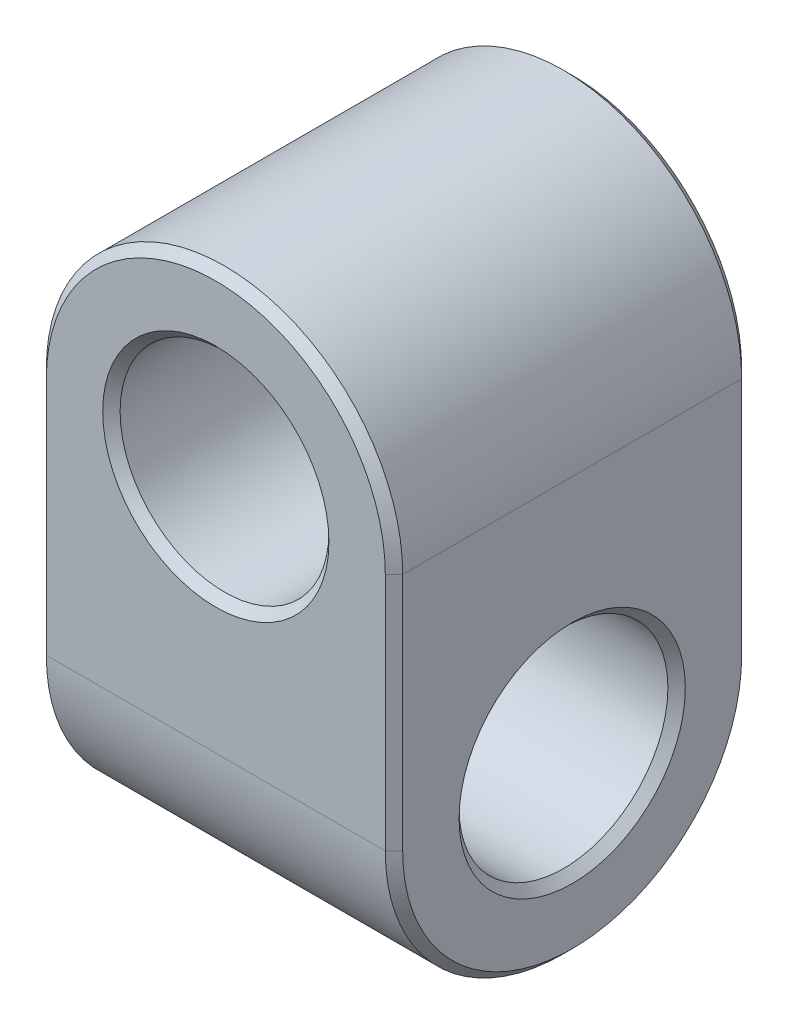
ISO-10303-21;
HEADER;
FILE_DESCRIPTION(('STEP AP214'),'2;1');
FILE_NAME('part.step','',(''),(''),'','','');
FILE_SCHEMA(('AUTOMOTIVE_DESIGN { 1 0 10303 214 1 1 1 1 }'));
ENDSEC;
DATA;
#1=APPLICATION_CONTEXT('core data for automotive mechanical design processes');
#2=APPLICATION_PROTOCOL_DEFINITION('international standard','automotive_design',2000,#1);
#3=PRODUCT_CONTEXT('',#1,'mechanical');
#4=PRODUCT('Part','Part','',(#3));
#5=PRODUCT_RELATED_PRODUCT_CATEGORY('part','',(#4));
#6=PRODUCT_DEFINITION_FORMATION('','',#4);
#7=PRODUCT_DEFINITION_CONTEXT('part definition',#1,'design');
#8=PRODUCT_DEFINITION('design','',#6,#7);
#9=PRODUCT_DEFINITION_SHAPE('','',#8);
#10=(LENGTH_UNIT() NAMED_UNIT(*) SI_UNIT(.MILLI.,.METRE.));
#11=(NAMED_UNIT(*) PLANE_ANGLE_UNIT() SI_UNIT($,.RADIAN.));
#12=(NAMED_UNIT(*) SI_UNIT($,.STERADIAN.) SOLID_ANGLE_UNIT());
#13=UNCERTAINTY_MEASURE_WITH_UNIT(LENGTH_MEASURE(1.E-05),#10,'distance_accuracy_value','');
#14=(GEOMETRIC_REPRESENTATION_CONTEXT(3) GLOBAL_UNCERTAINTY_ASSIGNED_CONTEXT((#13)) GLOBAL_UNIT_ASSIGNED_CONTEXT((#10,
#11,#12)) REPRESENTATION_CONTEXT('',''));
#15=CARTESIAN_POINT('',(0.,0.,0.));
#16=DIRECTION('',(0.,0.,1.));
#17=DIRECTION('',(1.,0.,0.));
#18=AXIS2_PLACEMENT_3D('',#15,#16,#17);
#19=CARTESIAN_POINT('',(8.128,9.525,16.256));
#20=DIRECTION('',(-1.,0.,0.));
#21=DIRECTION('',(0.,-1.,0.));
#22=AXIS2_PLACEMENT_3D('',#19,#20,#21);
#23=PLANE('',#22);
#24=CARTESIAN_POINT('',(8.128,-1.397,8.128));
#25=DIRECTION('',(-1.,0.,0.));
#26=DIRECTION('',(0.,-1.,0.));
#27=AXIS2_PLACEMENT_3D('',#24,#25,#26);
#28=CIRCLE('',#27,5.15937500000001);
#29=CARTESIAN_POINT('',(8.128,-6.55637500000001,8.128));
#30=VERTEX_POINT('',#29);
#31=EDGE_CURVE('E221',#30,#30,#28,.T.);
#32=ORIENTED_EDGE('',*,*,#31,.T.);
#33=EDGE_LOOP('',(#32));
#34=FACE_BOUND('',#33,.T.);
#35=CARTESIAN_POINT('',(8.128,-1.397,8.128));
#36=DIRECTION('',(-1.,0.,0.));
#37=DIRECTION('',(0.,-1.,0.));
#38=AXIS2_PLACEMENT_3D('',#35,#36,#37);
#39=CIRCLE('',#38,7.731125);
#40=CARTESIAN_POINT('',(8.128,-1.397,15.859125));
#41=VERTEX_POINT('',#40);
#42=CARTESIAN_POINT('',(8.128,-1.397,0.396875000000005));
#43=VERTEX_POINT('',#42);
#44=EDGE_CURVE('E217',#41,#43,#39,.F.);
#45=ORIENTED_EDGE('',*,*,#44,.T.);
#46=DIRECTION('',(0.,1.,0.));
#47=VECTOR('',#46,1.);
#48=CARTESIAN_POINT('',(8.128,9.525,0.396875000000005));
#49=LINE('',#48,#47);
#50=CARTESIAN_POINT('',(8.128,9.525,0.396875000000005));
#51=VERTEX_POINT('',#50);
#52=EDGE_CURVE('E219',#43,#51,#49,.T.);
#53=ORIENTED_EDGE('',*,*,#52,.T.);
#54=DIRECTION('',(0.,0.,-1.));
#55=VECTOR('',#54,1.);
#56=CARTESIAN_POINT('',(8.128,9.525,16.256));
#57=LINE('',#56,#55);
#58=CARTESIAN_POINT('',(8.128,9.525,15.859125));
#59=VERTEX_POINT('',#58);
#60=EDGE_CURVE('E151',#59,#51,#57,.T.);
#61=ORIENTED_EDGE('',*,*,#60,.F.);
#62=DIRECTION('',(0.,-1.,0.));
#63=VECTOR('',#62,1.);
#64=CARTESIAN_POINT('',(8.128,9.525,15.859125));
#65=LINE('',#64,#63);
#66=EDGE_CURVE('E215',#59,#41,#65,.T.);
#67=ORIENTED_EDGE('',*,*,#66,.T.);
#68=EDGE_LOOP('',(#45,#53,#61,#67));
#69=FACE_BOUND('',#68,.T.);
#70=ADVANCED_FACE('F61',(#34,#69),#23,.F.);
#71=CARTESIAN_POINT('',(-8.128,9.525,16.256));
#72=DIRECTION('',(1.,0.,0.));
#73=DIRECTION('',(0.,1.,0.));
#74=AXIS2_PLACEMENT_3D('',#71,#72,#73);
#75=PLANE('',#74);
#76=CARTESIAN_POINT('',(-8.128,-1.397,8.128));
#77=DIRECTION('',(1.,0.,0.));
#78=DIRECTION('',(0.,1.,0.));
#79=AXIS2_PLACEMENT_3D('',#76,#77,#78);
#80=CIRCLE('',#79,5.15937500000001);
#81=CARTESIAN_POINT('',(-8.128,3.76237500000001,8.128));
#82=VERTEX_POINT('',#81);
#83=EDGE_CURVE('E201',#82,#82,#80,.T.);
#84=ORIENTED_EDGE('',*,*,#83,.T.);
#85=EDGE_LOOP('',(#84));
#86=FACE_BOUND('',#85,.T.);
#87=DIRECTION('',(0.,0.,-1.));
#88=VECTOR('',#87,1.);
#89=CARTESIAN_POINT('',(-8.128,9.525,16.256));
#90=LINE('',#89,#88);
#91=CARTESIAN_POINT('',(-8.128,9.525,15.859125));
#92=VERTEX_POINT('',#91);
#93=CARTESIAN_POINT('',(-8.128,9.525,0.396875000000005));
#94=VERTEX_POINT('',#93);
#95=EDGE_CURVE('E134',#92,#94,#90,.T.);
#96=ORIENTED_EDGE('',*,*,#95,.T.);
#97=DIRECTION('',(0.,-1.,0.));
#98=VECTOR('',#97,1.);
#99=CARTESIAN_POINT('',(-8.128,-1.397,0.396875000000005));
#100=LINE('',#99,#98);
#101=CARTESIAN_POINT('',(-8.128,-1.397,0.396875000000005));
#102=VERTEX_POINT('',#101);
#103=EDGE_CURVE('E199',#94,#102,#100,.T.);
#104=ORIENTED_EDGE('',*,*,#103,.T.);
#105=CARTESIAN_POINT('',(-8.128,-1.397,8.128));
#106=DIRECTION('',(1.,0.,0.));
#107=DIRECTION('',(0.,1.,0.));
#108=AXIS2_PLACEMENT_3D('',#105,#106,#107);
#109=CIRCLE('',#108,7.731125);
#110=CARTESIAN_POINT('',(-8.128,-1.397,15.859125));
#111=VERTEX_POINT('',#110);
#112=EDGE_CURVE('E136',#102,#111,#109,.F.);
#113=ORIENTED_EDGE('',*,*,#112,.T.);
#114=DIRECTION('',(0.,1.,0.));
#115=VECTOR('',#114,1.);
#116=CARTESIAN_POINT('',(-8.128,9.525,15.859125));
#117=LINE('',#116,#115);
#118=EDGE_CURVE('E130',#111,#92,#117,.T.);
#119=ORIENTED_EDGE('',*,*,#118,.T.);
#120=EDGE_LOOP('',(#96,#104,#113,#119));
#121=FACE_BOUND('',#120,.T.);
#122=ADVANCED_FACE('F132',(#86,#121),#75,.F.);
#123=CARTESIAN_POINT('',(0.,9.525,0.));
#124=DIRECTION('',(0.,0.,-1.));
#125=DIRECTION('',(-1.,0.,0.));
#126=AXIS2_PLACEMENT_3D('',#123,#124,#125);
#127=PLANE('',#126);
#128=CARTESIAN_POINT('',(0.,9.525,0.));
#129=DIRECTION('',(0.,0.,1.));
#130=DIRECTION('',(1.,0.,0.));
#131=AXIS2_PLACEMENT_3D('',#128,#129,#130);
#132=CIRCLE('',#131,4.7625);
#133=CARTESIAN_POINT('',(4.7625,9.525,0.));
#134=VERTEX_POINT('',#133);
#135=EDGE_CURVE('E152',#134,#134,#132,.T.);
#136=ORIENTED_EDGE('',*,*,#135,.T.);
#137=EDGE_LOOP('',(#136));
#138=FACE_BOUND('',#137,.T.);
#139=DIRECTION('',(1.,0.,0.));
#140=VECTOR('',#139,1.);
#141=CARTESIAN_POINT('',(-21.5983841816037,-1.397,0.));
#142=LINE('',#141,#140);
#143=CARTESIAN_POINT('',(-7.731125,-1.397,0.));
#144=VERTEX_POINT('',#143);
#145=CARTESIAN_POINT('',(7.731125,-1.397,0.));
#146=VERTEX_POINT('',#145);
#147=EDGE_CURVE('E177',#144,#146,#142,.T.);
#148=ORIENTED_EDGE('',*,*,#147,.F.);
#149=DIRECTION('',(0.,1.,0.));
#150=VECTOR('',#149,1.);
#151=CARTESIAN_POINT('',(-7.731125,9.525,0.));
#152=LINE('',#151,#150);
#153=CARTESIAN_POINT('',(-7.731125,9.525,0.));
#154=VERTEX_POINT('',#153);
#155=EDGE_CURVE('E163',#144,#154,#152,.T.);
#156=ORIENTED_EDGE('',*,*,#155,.T.);
#157=CARTESIAN_POINT('',(0.,9.525,0.));
#158=DIRECTION('',(0.,0.,-1.));
#159=DIRECTION('',(-1.,0.,0.));
#160=AXIS2_PLACEMENT_3D('',#157,#158,#159);
#161=CIRCLE('',#160,7.731125);
#162=CARTESIAN_POINT('',(7.731125,9.525,0.));
#163=VERTEX_POINT('',#162);
#164=EDGE_CURVE('E86',#154,#163,#161,.T.);
#165=ORIENTED_EDGE('',*,*,#164,.T.);
#166=DIRECTION('',(0.,-1.,0.));
#167=VECTOR('',#166,1.);
#168=CARTESIAN_POINT('',(7.731125,-1.397,0.));
#169=LINE('',#168,#167);
#170=EDGE_CURVE('E224',#163,#146,#169,.T.);
#171=ORIENTED_EDGE('',*,*,#170,.T.);
#172=EDGE_LOOP('',(#148,#156,#165,#171));
#173=FACE_BOUND('',#172,.T.);
#174=ADVANCED_FACE('F238',(#138,#173),#127,.T.);
#175=CARTESIAN_POINT('',(0.,9.525,16.256));
#176=DIRECTION('',(0.,0.,-1.));
#177=DIRECTION('',(-1.,0.,0.));
#178=AXIS2_PLACEMENT_3D('',#175,#176,#177);
#179=PLANE('',#178);
#180=CARTESIAN_POINT('',(0.,9.525,16.256));
#181=DIRECTION('',(0.,0.,-1.));
#182=DIRECTION('',(-1.,0.,0.));
#183=AXIS2_PLACEMENT_3D('',#180,#181,#182);
#184=CIRCLE('',#183,5.159375);
#185=CARTESIAN_POINT('',(-5.15937500000001,9.525,16.256));
#186=VERTEX_POINT('',#185);
#187=EDGE_CURVE('E212',#186,#186,#184,.T.);
#188=ORIENTED_EDGE('',*,*,#187,.T.);
#189=EDGE_LOOP('',(#188));
#190=FACE_BOUND('',#189,.T.);
#191=CARTESIAN_POINT('',(0.,9.525,16.256));
#192=DIRECTION('',(0.,0.,-1.));
#193=DIRECTION('',(-1.,0.,0.));
#194=AXIS2_PLACEMENT_3D('',#191,#192,#193);
#195=CIRCLE('',#194,7.731125);
#196=CARTESIAN_POINT('',(7.731125,9.525,16.256));
#197=VERTEX_POINT('',#196);
#198=CARTESIAN_POINT('',(-7.731125,9.525,16.256));
#199=VERTEX_POINT('',#198);
#200=EDGE_CURVE('E209',#197,#199,#195,.F.);
#201=ORIENTED_EDGE('',*,*,#200,.T.);
#202=DIRECTION('',(0.,-1.,0.));
#203=VECTOR('',#202,1.);
#204=CARTESIAN_POINT('',(-7.731125,9.525,16.256));
#205=LINE('',#204,#203);
#206=CARTESIAN_POINT('',(-7.731125,-1.397,16.256));
#207=VERTEX_POINT('',#206);
#208=EDGE_CURVE('E166',#199,#207,#205,.T.);
#209=ORIENTED_EDGE('',*,*,#208,.T.);
#210=DIRECTION('',(1.,0.,0.));
#211=VECTOR('',#210,1.);
#212=CARTESIAN_POINT('',(-21.5983841816037,-1.397,16.256));
#213=LINE('',#212,#211);
#214=CARTESIAN_POINT('',(7.731125,-1.397,16.256));
#215=VERTEX_POINT('',#214);
#216=EDGE_CURVE('E183',#207,#215,#213,.T.);
#217=ORIENTED_EDGE('',*,*,#216,.T.);
#218=DIRECTION('',(0.,1.,0.));
#219=VECTOR('',#218,1.);
#220=CARTESIAN_POINT('',(7.731125,9.525,16.256));
#221=LINE('',#220,#219);
#222=EDGE_CURVE('E207',#215,#197,#221,.T.);
#223=ORIENTED_EDGE('',*,*,#222,.T.);
#224=EDGE_LOOP('',(#201,#209,#217,#223));
#225=FACE_BOUND('',#224,.T.);
#226=ADVANCED_FACE('F301',(#190,#225),#179,.F.);
#227=CARTESIAN_POINT('',(0.,9.525,16.256));
#228=DIRECTION('',(0.,0.,-1.));
#229=DIRECTION('',(-1.,0.,0.));
#230=AXIS2_PLACEMENT_3D('',#227,#228,#229);
#231=CYLINDRICAL_SURFACE('',#230,8.128);
#232=ORIENTED_EDGE('',*,*,#60,.T.);
#233=CARTESIAN_POINT('',(0.,9.525,0.396875000000005));
#234=DIRECTION('',(0.,0.,-1.));
#235=DIRECTION('',(-1.,0.,0.));
#236=AXIS2_PLACEMENT_3D('',#233,#234,#235);
#237=CIRCLE('',#236,8.128);
#238=EDGE_CURVE('E150',#51,#94,#237,.F.);
#239=ORIENTED_EDGE('',*,*,#238,.T.);
#240=ORIENTED_EDGE('',*,*,#95,.F.);
#241=CARTESIAN_POINT('',(0.,9.525,15.859125));
#242=DIRECTION('',(0.,0.,-1.));
#243=DIRECTION('',(-1.,0.,0.));
#244=AXIS2_PLACEMENT_3D('',#241,#242,#243);
#245=CIRCLE('',#244,8.128);
#246=EDGE_CURVE('E147',#92,#59,#245,.T.);
#247=ORIENTED_EDGE('',*,*,#246,.T.);
#248=EDGE_LOOP('',(#232,#239,#240,#247));
#249=FACE_BOUND('',#248,.T.);
#250=ADVANCED_FACE('F146',(#249),#231,.T.);
#251=CARTESIAN_POINT('',(0.,9.525,16.256));
#252=DIRECTION('',(0.,0.,-1.));
#253=DIRECTION('',(-1.,0.,0.));
#254=AXIS2_PLACEMENT_3D('',#251,#252,#253);
#255=CYLINDRICAL_SURFACE('',#254,4.7625);
#256=CARTESIAN_POINT('',(0.,9.525,15.859125));
#257=DIRECTION('',(0.,0.,-1.));
#258=DIRECTION('',(-1.,0.,0.));
#259=AXIS2_PLACEMENT_3D('',#256,#257,#258);
#260=CIRCLE('',#259,4.7625);
#261=CARTESIAN_POINT('',(-4.7625,9.525,15.859125));
#262=VERTEX_POINT('',#261);
#263=EDGE_CURVE('E204',#262,#262,#260,.F.);
#264=ORIENTED_EDGE('',*,*,#263,.T.);
#265=EDGE_LOOP('',(#264));
#266=FACE_BOUND('',#265,.T.);
#267=ORIENTED_EDGE('',*,*,#135,.F.);
#268=EDGE_LOOP('',(#267));
#269=FACE_BOUND('',#268,.T.);
#270=ADVANCED_FACE('F295',(#266,#269),#255,.F.);
#271=CARTESIAN_POINT('',(-21.5983841816037,-1.397,8.128));
#272=DIRECTION('',(1.,0.,0.));
#273=DIRECTION('',(0.,1.,0.));
#274=AXIS2_PLACEMENT_3D('',#271,#272,#273);
#275=CYLINDRICAL_SURFACE('',#274,8.128);
#276=ORIENTED_EDGE('',*,*,#216,.F.);
#277=CARTESIAN_POINT('',(-7.731125,-1.397,8.128));
#278=DIRECTION('',(1.,0.,0.));
#279=DIRECTION('',(0.,0.,-1.));
#280=AXIS2_PLACEMENT_3D('',#277,#278,#279);
#281=CIRCLE('',#280,8.128);
#282=EDGE_CURVE('E12',#207,#144,#281,.T.);
#283=ORIENTED_EDGE('',*,*,#282,.T.);
#284=ORIENTED_EDGE('',*,*,#147,.T.);
#285=CARTESIAN_POINT('',(7.731125,-1.397,8.128));
#286=DIRECTION('',(-1.,0.,0.));
#287=DIRECTION('',(0.,0.,1.));
#288=AXIS2_PLACEMENT_3D('',#285,#286,#287);
#289=CIRCLE('',#288,8.128);
#290=EDGE_CURVE('E71',#146,#215,#289,.T.);
#291=ORIENTED_EDGE('',*,*,#290,.T.);
#292=EDGE_LOOP('',(#276,#283,#284,#291));
#293=FACE_BOUND('',#292,.T.);
#294=ADVANCED_FACE('F237',(#293),#275,.T.);
#295=CARTESIAN_POINT('',(-21.5983841816037,-1.397,8.128));
#296=DIRECTION('',(1.,0.,0.));
#297=DIRECTION('',(0.,1.,0.));
#298=AXIS2_PLACEMENT_3D('',#295,#296,#297);
#299=CYLINDRICAL_SURFACE('',#298,4.7625);
#300=CARTESIAN_POINT('',(-7.73112499999999,-1.397,8.128));
#301=DIRECTION('',(1.,0.,0.));
#302=DIRECTION('',(0.,0.,-1.));
#303=AXIS2_PLACEMENT_3D('',#300,#301,#302);
#304=CIRCLE('',#303,4.7625);
#305=CARTESIAN_POINT('',(-7.73112499999999,-1.397,3.3655));
#306=VERTEX_POINT('',#305);
#307=EDGE_CURVE('E141',#306,#306,#304,.F.);
#308=ORIENTED_EDGE('',*,*,#307,.T.);
#309=EDGE_LOOP('',(#308));
#310=FACE_BOUND('',#309,.T.);
#311=CARTESIAN_POINT('',(7.731125,-1.397,8.128));
#312=DIRECTION('',(-1.,0.,0.));
#313=DIRECTION('',(0.,0.,1.));
#314=AXIS2_PLACEMENT_3D('',#311,#312,#313);
#315=CIRCLE('',#314,4.7625);
#316=CARTESIAN_POINT('',(7.731125,-1.397,12.8905));
#317=VERTEX_POINT('',#316);
#318=EDGE_CURVE('E193',#317,#317,#315,.F.);
#319=ORIENTED_EDGE('',*,*,#318,.T.);
#320=EDGE_LOOP('',(#319));
#321=FACE_BOUND('',#320,.T.);
#322=ADVANCED_FACE('F268',(#310,#321),#299,.F.);
#323=CARTESIAN_POINT('',(-7.73112499999999,-1.397,8.128));
#324=DIRECTION('',(-1.,0.,0.));
#325=DIRECTION('',(0.,0.,1.));
#326=AXIS2_PLACEMENT_3D('',#323,#324,#325);
#327=CONICAL_SURFACE('',#326,4.7625,0.78539816339745);
#328=ORIENTED_EDGE('',*,*,#83,.F.);
#329=EDGE_LOOP('',(#328));
#330=FACE_BOUND('',#329,.T.);
#331=ORIENTED_EDGE('',*,*,#307,.F.);
#332=EDGE_LOOP('',(#331));
#333=FACE_BOUND('',#332,.T.);
#334=ADVANCED_FACE('F261',(#330,#333),#327,.F.);
#335=CARTESIAN_POINT('',(0.,9.525,15.859125));
#336=DIRECTION('',(0.,0.,1.));
#337=DIRECTION('',(1.,0.,0.));
#338=AXIS2_PLACEMENT_3D('',#335,#336,#337);
#339=CONICAL_SURFACE('',#338,4.7625,0.785398163397447);
#340=ORIENTED_EDGE('',*,*,#187,.F.);
#341=EDGE_LOOP('',(#340));
#342=FACE_BOUND('',#341,.T.);
#343=ORIENTED_EDGE('',*,*,#263,.F.);
#344=EDGE_LOOP('',(#343));
#345=FACE_BOUND('',#344,.T.);
#346=ADVANCED_FACE('F267',(#342,#345),#339,.F.);
#347=CARTESIAN_POINT('',(7.731125,-1.397,8.128));
#348=DIRECTION('',(1.,0.,0.));
#349=DIRECTION('',(0.,0.,-1.));
#350=AXIS2_PLACEMENT_3D('',#347,#348,#349);
#351=CONICAL_SURFACE('',#350,4.7625,0.785398163397455);
#352=ORIENTED_EDGE('',*,*,#31,.F.);
#353=EDGE_LOOP('',(#352));
#354=FACE_BOUND('',#353,.T.);
#355=ORIENTED_EDGE('',*,*,#318,.F.);
#356=EDGE_LOOP('',(#355));
#357=FACE_BOUND('',#356,.T.);
#358=ADVANCED_FACE('F274',(#354,#357),#351,.F.);
#359=CARTESIAN_POINT('',(7.731125,9.525,16.256));
#360=DIRECTION('',(-0.707106781186551,0.,-0.707106781186544));
#361=DIRECTION('',(0.,1.,0.));
#362=AXIS2_PLACEMENT_3D('',#359,#360,#361);
#363=PLANE('',#362);
#364=DIRECTION('',(0.707106781186544,0.,-0.707106781186551));
#365=VECTOR('',#364,1.);
#366=CARTESIAN_POINT('',(7.731125,9.525,16.256));
#367=LINE('',#366,#365);
#368=EDGE_CURVE('E162',#197,#59,#367,.T.);
#369=ORIENTED_EDGE('',*,*,#368,.F.);
#370=ORIENTED_EDGE('',*,*,#222,.F.);
#371=DIRECTION('',(-0.707106781186544,0.,0.707106781186551));
#372=VECTOR('',#371,1.);
#373=CARTESIAN_POINT('',(8.128,-1.397,15.859125));
#374=LINE('',#373,#372);
#375=EDGE_CURVE('E66',#41,#215,#374,.T.);
#376=ORIENTED_EDGE('',*,*,#375,.F.);
#377=ORIENTED_EDGE('',*,*,#66,.F.);
#378=EDGE_LOOP('',(#369,#370,#376,#377));
#379=FACE_BOUND('',#378,.T.);
#380=ADVANCED_FACE('F64',(#379),#363,.F.);
#381=CARTESIAN_POINT('',(7.731125,-1.397,8.128));
#382=DIRECTION('',(-1.,0.,0.));
#383=DIRECTION('',(0.,0.,1.));
#384=AXIS2_PLACEMENT_3D('',#381,#382,#383);
#385=CONICAL_SURFACE('',#384,8.128,0.785398163397453);
#386=ORIENTED_EDGE('',*,*,#375,.T.);
#387=ORIENTED_EDGE('',*,*,#290,.F.);
#388=DIRECTION('',(-0.707106781186544,0.,-0.707106781186551));
#389=VECTOR('',#388,1.);
#390=CARTESIAN_POINT('',(8.128,-1.397,0.396875000000005));
#391=LINE('',#390,#389);
#392=EDGE_CURVE('E167',#43,#146,#391,.T.);
#393=ORIENTED_EDGE('',*,*,#392,.F.);
#394=ORIENTED_EDGE('',*,*,#44,.F.);
#395=EDGE_LOOP('',(#386,#387,#393,#394));
#396=FACE_BOUND('',#395,.T.);
#397=ADVANCED_FACE('F283',(#396),#385,.T.);
#398=CARTESIAN_POINT('',(0.,9.525,16.256));
#399=DIRECTION('',(0.,0.,-1.));
#400=DIRECTION('',(-1.,0.,0.));
#401=AXIS2_PLACEMENT_3D('',#398,#399,#400);
#402=CONICAL_SURFACE('',#401,7.731125,0.785398163397444);
#403=ORIENTED_EDGE('',*,*,#368,.T.);
#404=ORIENTED_EDGE('',*,*,#246,.F.);
#405=DIRECTION('',(-0.707106781186544,0.,-0.707106781186551));
#406=VECTOR('',#405,1.);
#407=CARTESIAN_POINT('',(-7.731125,9.525,16.256));
#408=LINE('',#407,#406);
#409=EDGE_CURVE('E159',#199,#92,#408,.T.);
#410=ORIENTED_EDGE('',*,*,#409,.F.);
#411=ORIENTED_EDGE('',*,*,#200,.F.);
#412=EDGE_LOOP('',(#403,#404,#410,#411));
#413=FACE_BOUND('',#412,.T.);
#414=ADVANCED_FACE('F157',(#413),#402,.T.);
#415=CARTESIAN_POINT('',(8.128,9.525,0.396875000000005));
#416=DIRECTION('',(0.707106781186551,0.,-0.707106781186544));
#417=DIRECTION('',(0.,-1.,0.));
#418=AXIS2_PLACEMENT_3D('',#415,#416,#417);
#419=PLANE('',#418);
#420=ORIENTED_EDGE('',*,*,#392,.T.);
#421=ORIENTED_EDGE('',*,*,#170,.F.);
#422=DIRECTION('',(-0.707106781186544,0.,-0.707106781186551));
#423=VECTOR('',#422,1.);
#424=CARTESIAN_POINT('',(8.128,9.525,0.396875000000005));
#425=LINE('',#424,#423);
#426=EDGE_CURVE('E168',#51,#163,#425,.T.);
#427=ORIENTED_EDGE('',*,*,#426,.F.);
#428=ORIENTED_EDGE('',*,*,#52,.F.);
#429=EDGE_LOOP('',(#420,#421,#427,#428));
#430=FACE_BOUND('',#429,.T.);
#431=ADVANCED_FACE('F373',(#430),#419,.T.);
#432=CARTESIAN_POINT('',(-7.731125,9.525,16.256));
#433=DIRECTION('',(0.707106781186551,0.,-0.707106781186544));
#434=DIRECTION('',(0.,-1.,0.));
#435=AXIS2_PLACEMENT_3D('',#432,#433,#434);
#436=PLANE('',#435);
#437=ORIENTED_EDGE('',*,*,#409,.T.);
#438=ORIENTED_EDGE('',*,*,#118,.F.);
#439=DIRECTION('',(-0.707106781186544,0.,-0.707106781186551));
#440=VECTOR('',#439,1.);
#441=CARTESIAN_POINT('',(-7.731125,-1.397,16.256));
#442=LINE('',#441,#440);
#443=EDGE_CURVE('E173',#207,#111,#442,.T.);
#444=ORIENTED_EDGE('',*,*,#443,.F.);
#445=ORIENTED_EDGE('',*,*,#208,.F.);
#446=EDGE_LOOP('',(#437,#438,#444,#445));
#447=FACE_BOUND('',#446,.T.);
#448=ADVANCED_FACE('F165',(#447),#436,.F.);
#449=CARTESIAN_POINT('',(0.,9.525,0.396875000000005));
#450=DIRECTION('',(0.,0.,1.));
#451=DIRECTION('',(1.,0.,0.));
#452=AXIS2_PLACEMENT_3D('',#449,#450,#451);
#453=CONICAL_SURFACE('',#452,8.128,0.785398163397444);
#454=ORIENTED_EDGE('',*,*,#426,.T.);
#455=ORIENTED_EDGE('',*,*,#164,.F.);
#456=DIRECTION('',(0.707106781186544,0.,-0.707106781186551));
#457=VECTOR('',#456,1.);
#458=CARTESIAN_POINT('',(-8.128,9.525,0.396875000000005));
#459=LINE('',#458,#457);
#460=EDGE_CURVE('E79',#94,#154,#459,.T.);
#461=ORIENTED_EDGE('',*,*,#460,.F.);
#462=ORIENTED_EDGE('',*,*,#238,.F.);
#463=EDGE_LOOP('',(#454,#455,#461,#462));
#464=FACE_BOUND('',#463,.T.);
#465=ADVANCED_FACE('F245',(#464),#453,.T.);
#466=CARTESIAN_POINT('',(-7.731125,-1.397,8.128));
#467=DIRECTION('',(1.,0.,0.));
#468=DIRECTION('',(0.,0.,-1.));
#469=AXIS2_PLACEMENT_3D('',#466,#467,#468);
#470=CONICAL_SURFACE('',#469,8.128,0.78539816339745);
#471=ORIENTED_EDGE('',*,*,#443,.T.);
#472=ORIENTED_EDGE('',*,*,#112,.F.);
#473=DIRECTION('',(-0.707106781186546,0.,0.707106781186549));
#474=VECTOR('',#473,1.);
#475=CARTESIAN_POINT('',(-7.731125,-1.397,0.));
#476=LINE('',#475,#474);
#477=EDGE_CURVE('E230',#144,#102,#476,.T.);
#478=ORIENTED_EDGE('',*,*,#477,.F.);
#479=ORIENTED_EDGE('',*,*,#282,.F.);
#480=EDGE_LOOP('',(#471,#472,#478,#479));
#481=FACE_BOUND('',#480,.T.);
#482=ADVANCED_FACE('F234',(#481),#470,.T.);
#483=CARTESIAN_POINT('',(-8.128,9.525,0.396875000000005));
#484=DIRECTION('',(-0.707106781186551,0.,-0.707106781186544));
#485=DIRECTION('',(0.,1.,0.));
#486=AXIS2_PLACEMENT_3D('',#483,#484,#485);
#487=PLANE('',#486);
#488=ORIENTED_EDGE('',*,*,#460,.T.);
#489=ORIENTED_EDGE('',*,*,#155,.F.);
#490=ORIENTED_EDGE('',*,*,#477,.T.);
#491=ORIENTED_EDGE('',*,*,#103,.F.);
#492=EDGE_LOOP('',(#488,#489,#490,#491));
#493=FACE_BOUND('',#492,.T.);
#494=ADVANCED_FACE('F239',(#493),#487,.T.);
#495=CLOSED_SHELL('',(#70,#122,#174,#226,#250,#270,#294,#322,#334,#346,#358,#380,#397,#414,#431,
#448,#465,#482,#494));
#496=MANIFOLD_SOLID_BREP('B2',#495);
#497=ADVANCED_BREP_SHAPE_REPRESENTATION('',(#18,#496),#14);
#498=SHAPE_DEFINITION_REPRESENTATION(#9,#497);
ENDSEC;
END-ISO-10303-21;
